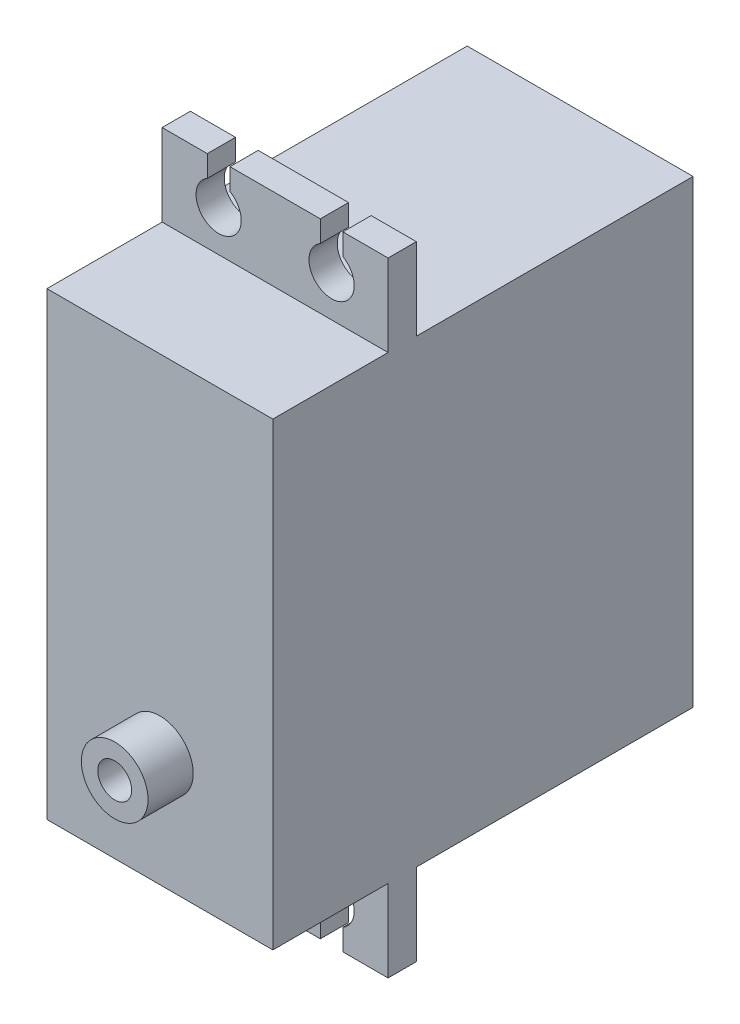
ISO-10303-21;
HEADER;
FILE_DESCRIPTION(('STEP AP214'),'2;1');
FILE_NAME('part.step','',(''),(''),'','','');
FILE_SCHEMA(('AUTOMOTIVE_DESIGN { 1 0 10303 214 1 1 1 1 }'));
ENDSEC;
DATA;
#1=APPLICATION_CONTEXT('core data for automotive mechanical design processes');
#2=APPLICATION_PROTOCOL_DEFINITION('international standard','automotive_design',2000,#1);
#3=PRODUCT_CONTEXT('',#1,'mechanical');
#4=PRODUCT('Part','Part','',(#3));
#5=PRODUCT_RELATED_PRODUCT_CATEGORY('part','',(#4));
#6=PRODUCT_DEFINITION_FORMATION('','',#4);
#7=PRODUCT_DEFINITION_CONTEXT('part definition',#1,'design');
#8=PRODUCT_DEFINITION('design','',#6,#7);
#9=PRODUCT_DEFINITION_SHAPE('','',#8);
#10=(LENGTH_UNIT() NAMED_UNIT(*) SI_UNIT(.MILLI.,.METRE.));
#11=(NAMED_UNIT(*) PLANE_ANGLE_UNIT() SI_UNIT($,.RADIAN.));
#12=(NAMED_UNIT(*) SI_UNIT($,.STERADIAN.) SOLID_ANGLE_UNIT());
#13=UNCERTAINTY_MEASURE_WITH_UNIT(LENGTH_MEASURE(1.E-05),#10,'distance_accuracy_value','');
#14=(GEOMETRIC_REPRESENTATION_CONTEXT(3) GLOBAL_UNCERTAINTY_ASSIGNED_CONTEXT((#13)) GLOBAL_UNIT_ASSIGNED_CONTEXT((#10,
#11,#12)) REPRESENTATION_CONTEXT('',''));
#15=CARTESIAN_POINT('',(0.,0.,0.));
#16=DIRECTION('',(0.,0.,1.));
#17=DIRECTION('',(1.,0.,0.));
#18=AXIS2_PLACEMENT_3D('',#15,#16,#17);
#19=CARTESIAN_POINT('',(10.,-20.35,5.89999999999999));
#20=DIRECTION('',(0.,1.,0.));
#21=DIRECTION('',(0.,0.,1.));
#22=AXIS2_PLACEMENT_3D('',#19,#20,#21);
#23=PLANE('',#22);
#24=DIRECTION('',(0.,0.,-1.));
#25=VECTOR('',#24,1.);
#26=CARTESIAN_POINT('',(-10.,-20.35,5.89999999999999));
#27=LINE('',#26,#25);
#28=CARTESIAN_POINT('',(-10.,-20.35,5.89999999999999));
#29=VERTEX_POINT('',#28);
#30=CARTESIAN_POINT('',(-10.,-20.35,-18.6));
#31=VERTEX_POINT('',#30);
#32=EDGE_CURVE('E369',#29,#31,#27,.T.);
#33=ORIENTED_EDGE('',*,*,#32,.T.);
#34=DIRECTION('',(-1.,0.,0.));
#35=VECTOR('',#34,1.);
#36=CARTESIAN_POINT('',(10.,-20.35,-18.6));
#37=LINE('',#36,#35);
#38=CARTESIAN_POINT('',(10.,-20.35,-18.6));
#39=VERTEX_POINT('',#38);
#40=EDGE_CURVE('E530',#39,#31,#37,.T.);
#41=ORIENTED_EDGE('',*,*,#40,.F.);
#42=DIRECTION('',(0.,0.,-1.));
#43=VECTOR('',#42,1.);
#44=CARTESIAN_POINT('',(10.,-20.35,5.89999999999999));
#45=LINE('',#44,#43);
#46=CARTESIAN_POINT('',(10.,-20.35,5.89999999999999));
#47=VERTEX_POINT('',#46);
#48=EDGE_CURVE('E401',#47,#39,#45,.T.);
#49=ORIENTED_EDGE('',*,*,#48,.F.);
#50=DIRECTION('',(-1.,0.,0.));
#51=VECTOR('',#50,1.);
#52=CARTESIAN_POINT('',(10.,-20.35,5.89999999999999));
#53=LINE('',#52,#51);
#54=EDGE_CURVE('E439',#47,#29,#53,.T.);
#55=ORIENTED_EDGE('',*,*,#54,.T.);
#56=EDGE_LOOP('',(#33,#41,#49,#55));
#57=FACE_BOUND('',#56,.T.);
#58=DIRECTION('',(0.,0.,-1.));
#59=VECTOR('',#58,1.);
#60=CARTESIAN_POINT('',(-3.,-20.35,-16.6));
#61=LINE('',#60,#59);
#62=CARTESIAN_POINT('',(-3.,-20.35,-13.1));
#63=VERTEX_POINT('',#62);
#64=CARTESIAN_POINT('',(-3.,-20.35,-16.6));
#65=VERTEX_POINT('',#64);
#66=EDGE_CURVE('E276',#63,#65,#61,.T.);
#67=ORIENTED_EDGE('',*,*,#66,.F.);
#68=DIRECTION('',(-1.,0.,0.));
#69=VECTOR('',#68,1.);
#70=CARTESIAN_POINT('',(3.,-20.35,-13.1));
#71=LINE('',#70,#69);
#72=CARTESIAN_POINT('',(3.,-20.35,-13.1));
#73=VERTEX_POINT('',#72);
#74=EDGE_CURVE('E273',#73,#63,#71,.T.);
#75=ORIENTED_EDGE('',*,*,#74,.F.);
#76=DIRECTION('',(0.,0.,1.));
#77=VECTOR('',#76,1.);
#78=CARTESIAN_POINT('',(3.,-20.35,-16.6));
#79=LINE('',#78,#77);
#80=CARTESIAN_POINT('',(3.,-20.35,-16.6));
#81=VERTEX_POINT('',#80);
#82=EDGE_CURVE('E65',#81,#73,#79,.T.);
#83=ORIENTED_EDGE('',*,*,#82,.F.);
#84=DIRECTION('',(1.,0.,0.));
#85=VECTOR('',#84,1.);
#86=CARTESIAN_POINT('',(3.,-20.35,-16.6));
#87=LINE('',#86,#85);
#88=EDGE_CURVE('E60',#65,#81,#87,.T.);
#89=ORIENTED_EDGE('',*,*,#88,.F.);
#90=EDGE_LOOP('',(#67,#75,#83,#89));
#91=FACE_BOUND('',#90,.T.);
#92=ADVANCED_FACE('F45',(#57,#91),#23,.F.);
#93=CARTESIAN_POINT('',(10.,20.35,5.89999999999999));
#94=DIRECTION('',(0.,0.,1.));
#95=DIRECTION('',(0.,-1.,0.));
#96=AXIS2_PLACEMENT_3D('',#93,#94,#95);
#97=PLANE('',#96);
#98=DIRECTION('',(0.,-1.,0.));
#99=VECTOR('',#98,1.);
#100=CARTESIAN_POINT('',(6.,20.35,5.89999999999999));
#101=LINE('',#100,#99);
#102=CARTESIAN_POINT('',(6.,27.6,5.89999999999999));
#103=VERTEX_POINT('',#102);
#104=CARTESIAN_POINT('',(6.,25.7070508075689,5.89999999999999));
#105=VERTEX_POINT('',#104);
#106=EDGE_CURVE('E349',#103,#105,#101,.T.);
#107=ORIENTED_EDGE('',*,*,#106,.F.);
#108=DIRECTION('',(-1.,0.,0.));
#109=VECTOR('',#108,1.);
#110=CARTESIAN_POINT('',(10.,27.6,5.89999999999999));
#111=LINE('',#110,#109);
#112=CARTESIAN_POINT('',(10.,27.6,5.89999999999999));
#113=VERTEX_POINT('',#112);
#114=EDGE_CURVE('E517',#113,#103,#111,.T.);
#115=ORIENTED_EDGE('',*,*,#114,.F.);
#116=DIRECTION('',(0.,1.,0.));
#117=VECTOR('',#116,1.);
#118=CARTESIAN_POINT('',(10.,20.35,5.89999999999999));
#119=LINE('',#118,#117);
#120=CARTESIAN_POINT('',(10.,20.35,5.89999999999999));
#121=VERTEX_POINT('',#120);
#122=EDGE_CURVE('E412',#121,#113,#119,.T.);
#123=ORIENTED_EDGE('',*,*,#122,.F.);
#124=DIRECTION('',(-1.,0.,0.));
#125=VECTOR('',#124,1.);
#126=CARTESIAN_POINT('',(10.,20.35,5.89999999999999));
#127=LINE('',#126,#125);
#128=CARTESIAN_POINT('',(-10.,20.35,5.89999999999999));
#129=VERTEX_POINT('',#128);
#130=EDGE_CURVE('E521',#121,#129,#127,.T.);
#131=ORIENTED_EDGE('',*,*,#130,.T.);
#132=DIRECTION('',(0.,1.,0.));
#133=VECTOR('',#132,1.);
#134=CARTESIAN_POINT('',(-10.,20.35,5.89999999999999));
#135=LINE('',#134,#133);
#136=CARTESIAN_POINT('',(-10.,27.6,5.89999999999999));
#137=VERTEX_POINT('',#136);
#138=EDGE_CURVE('E449',#129,#137,#135,.T.);
#139=ORIENTED_EDGE('',*,*,#138,.T.);
#140=CARTESIAN_POINT('',(-6.,27.6,5.89999999999999));
#141=VERTEX_POINT('',#140);
#142=EDGE_CURVE('E515',#141,#137,#111,.T.);
#143=ORIENTED_EDGE('',*,*,#142,.F.);
#144=DIRECTION('',(0.,1.,0.));
#145=VECTOR('',#144,1.);
#146=CARTESIAN_POINT('',(-6.,20.35,5.89999999999999));
#147=LINE('',#146,#145);
#148=CARTESIAN_POINT('',(-6.,25.7070508075689,5.89999999999999));
#149=VERTEX_POINT('',#148);
#150=EDGE_CURVE('E306',#149,#141,#147,.T.);
#151=ORIENTED_EDGE('',*,*,#150,.F.);
#152=CARTESIAN_POINT('',(-5.,23.975,5.89999999999999));
#153=DIRECTION('',(0.,0.,1.));
#154=DIRECTION('',(0.,-1.,0.));
#155=AXIS2_PLACEMENT_3D('',#152,#153,#154);
#156=CIRCLE('',#155,2.);
#157=CARTESIAN_POINT('',(-4.,25.7070508075689,5.89999999999999));
#158=VERTEX_POINT('',#157);
#159=EDGE_CURVE('E337',#158,#149,#156,.F.);
#160=ORIENTED_EDGE('',*,*,#159,.F.);
#161=DIRECTION('',(0.,-1.,0.));
#162=VECTOR('',#161,1.);
#163=CARTESIAN_POINT('',(-4.,20.35,5.89999999999999));
#164=LINE('',#163,#162);
#165=CARTESIAN_POINT('',(-4.,27.6,5.89999999999999));
#166=VERTEX_POINT('',#165);
#167=EDGE_CURVE('E340',#166,#158,#164,.T.);
#168=ORIENTED_EDGE('',*,*,#167,.F.);
#169=CARTESIAN_POINT('',(4.,27.6,5.89999999999999));
#170=VERTEX_POINT('',#169);
#171=EDGE_CURVE('E522',#170,#166,#111,.T.);
#172=ORIENTED_EDGE('',*,*,#171,.F.);
#173=DIRECTION('',(0.,1.,0.));
#174=VECTOR('',#173,1.);
#175=CARTESIAN_POINT('',(4.,20.35,5.89999999999999));
#176=LINE('',#175,#174);
#177=CARTESIAN_POINT('',(4.,25.7070508075689,5.89999999999999));
#178=VERTEX_POINT('',#177);
#179=EDGE_CURVE('E343',#178,#170,#176,.T.);
#180=ORIENTED_EDGE('',*,*,#179,.F.);
#181=CARTESIAN_POINT('',(5.,23.975,5.89999999999999));
#182=DIRECTION('',(0.,0.,1.));
#183=DIRECTION('',(0.,-1.,0.));
#184=AXIS2_PLACEMENT_3D('',#181,#182,#183);
#185=CIRCLE('',#184,2.);
#186=EDGE_CURVE('E346',#105,#178,#185,.F.);
#187=ORIENTED_EDGE('',*,*,#186,.F.);
#188=EDGE_LOOP('',(#107,#115,#123,#131,#139,#143,#151,#160,#168,#172,#180,#187));
#189=FACE_BOUND('',#188,.T.);
#190=ADVANCED_FACE('F635',(#189),#97,.F.);
#191=CARTESIAN_POINT('',(10.,27.6,5.89999999999999));
#192=DIRECTION('',(0.,-1.,0.));
#193=DIRECTION('',(0.,0.,-1.));
#194=AXIS2_PLACEMENT_3D('',#191,#192,#193);
#195=PLANE('',#194);
#196=DIRECTION('',(0.,0.,1.));
#197=VECTOR('',#196,1.);
#198=CARTESIAN_POINT('',(6.,27.6,-18.6));
#199=LINE('',#198,#197);
#200=CARTESIAN_POINT('',(6.,27.6,8.39999999999999));
#201=VERTEX_POINT('',#200);
#202=EDGE_CURVE('E302',#103,#201,#199,.T.);
#203=ORIENTED_EDGE('',*,*,#202,.T.);
#204=DIRECTION('',(-1.,0.,0.));
#205=VECTOR('',#204,1.);
#206=CARTESIAN_POINT('',(10.,27.6,8.39999999999999));
#207=LINE('',#206,#205);
#208=CARTESIAN_POINT('',(10.,27.6,8.39999999999999));
#209=VERTEX_POINT('',#208);
#210=EDGE_CURVE('E511',#209,#201,#207,.T.);
#211=ORIENTED_EDGE('',*,*,#210,.F.);
#212=DIRECTION('',(0.,0.,1.));
#213=VECTOR('',#212,1.);
#214=CARTESIAN_POINT('',(10.,27.6,5.89999999999999));
#215=LINE('',#214,#213);
#216=EDGE_CURVE('E415',#113,#209,#215,.T.);
#217=ORIENTED_EDGE('',*,*,#216,.F.);
#218=ORIENTED_EDGE('',*,*,#114,.T.);
#219=EDGE_LOOP('',(#203,#211,#217,#218));
#220=FACE_BOUND('',#219,.T.);
#221=ADVANCED_FACE('F649',(#220),#195,.F.);
#222=DIRECTION('',(0.,0.,1.));
#223=VECTOR('',#222,1.);
#224=CARTESIAN_POINT('',(4.,27.6,-18.6));
#225=LINE('',#224,#223);
#226=CARTESIAN_POINT('',(4.,27.6,8.39999999999999));
#227=VERTEX_POINT('',#226);
#228=EDGE_CURVE('E310',#170,#227,#225,.T.);
#229=ORIENTED_EDGE('',*,*,#228,.F.);
#230=ORIENTED_EDGE('',*,*,#171,.T.);
#231=DIRECTION('',(0.,0.,1.));
#232=VECTOR('',#231,1.);
#233=CARTESIAN_POINT('',(-4.,27.6,-18.6));
#234=LINE('',#233,#232);
#235=CARTESIAN_POINT('',(-4.,27.6,8.39999999999999));
#236=VERTEX_POINT('',#235);
#237=EDGE_CURVE('E294',#166,#236,#234,.T.);
#238=ORIENTED_EDGE('',*,*,#237,.T.);
#239=EDGE_CURVE('E516',#227,#236,#207,.T.);
#240=ORIENTED_EDGE('',*,*,#239,.F.);
#241=EDGE_LOOP('',(#229,#230,#238,#240));
#242=FACE_BOUND('',#241,.T.);
#243=ADVANCED_FACE('F665',(#242),#195,.F.);
#244=DIRECTION('',(0.,0.,1.));
#245=VECTOR('',#244,1.);
#246=CARTESIAN_POINT('',(-6.,27.6,-18.6));
#247=LINE('',#246,#245);
#248=CARTESIAN_POINT('',(-6.,27.6,8.39999999999999));
#249=VERTEX_POINT('',#248);
#250=EDGE_CURVE('E323',#141,#249,#247,.T.);
#251=ORIENTED_EDGE('',*,*,#250,.F.);
#252=ORIENTED_EDGE('',*,*,#142,.T.);
#253=DIRECTION('',(0.,0.,1.));
#254=VECTOR('',#253,1.);
#255=CARTESIAN_POINT('',(-10.,27.6,5.89999999999999));
#256=LINE('',#255,#254);
#257=CARTESIAN_POINT('',(-10.,27.6,8.39999999999999));
#258=VERTEX_POINT('',#257);
#259=EDGE_CURVE('E453',#137,#258,#256,.T.);
#260=ORIENTED_EDGE('',*,*,#259,.T.);
#261=EDGE_CURVE('E510',#249,#258,#207,.T.);
#262=ORIENTED_EDGE('',*,*,#261,.F.);
#263=EDGE_LOOP('',(#251,#252,#260,#262));
#264=FACE_BOUND('',#263,.T.);
#265=ADVANCED_FACE('F629',(#264),#195,.F.);
#266=CARTESIAN_POINT('',(10.,27.6,8.39999999999999));
#267=DIRECTION('',(0.,0.,-1.));
#268=DIRECTION('',(0.,1.,0.));
#269=AXIS2_PLACEMENT_3D('',#266,#267,#268);
#270=PLANE('',#269);
#271=DIRECTION('',(0.,-1.,0.));
#272=VECTOR('',#271,1.);
#273=CARTESIAN_POINT('',(6.,25.7070508075689,8.39999999999999));
#274=LINE('',#273,#272);
#275=CARTESIAN_POINT('',(6.,25.7070508075689,8.39999999999999));
#276=VERTEX_POINT('',#275);
#277=EDGE_CURVE('E289',#201,#276,#274,.T.);
#278=ORIENTED_EDGE('',*,*,#277,.T.);
#279=CARTESIAN_POINT('',(5.,23.975,8.39999999999999));
#280=DIRECTION('',(0.,0.,-1.));
#281=DIRECTION('',(-1.,0.,0.));
#282=AXIS2_PLACEMENT_3D('',#279,#280,#281);
#283=CIRCLE('',#282,2.);
#284=CARTESIAN_POINT('',(4.,25.7070508075689,8.39999999999999));
#285=VERTEX_POINT('',#284);
#286=EDGE_CURVE('E298',#276,#285,#283,.T.);
#287=ORIENTED_EDGE('',*,*,#286,.T.);
#288=DIRECTION('',(0.,1.,0.));
#289=VECTOR('',#288,1.);
#290=CARTESIAN_POINT('',(4.,27.6,8.39999999999999));
#291=LINE('',#290,#289);
#292=EDGE_CURVE('E293',#285,#227,#291,.T.);
#293=ORIENTED_EDGE('',*,*,#292,.T.);
#294=ORIENTED_EDGE('',*,*,#239,.T.);
#295=DIRECTION('',(0.,-1.,0.));
#296=VECTOR('',#295,1.);
#297=CARTESIAN_POINT('',(-4.,27.6,8.39999999999999));
#298=LINE('',#297,#296);
#299=CARTESIAN_POINT('',(-4.,25.7070508075689,8.39999999999999));
#300=VERTEX_POINT('',#299);
#301=EDGE_CURVE('E319',#236,#300,#298,.T.);
#302=ORIENTED_EDGE('',*,*,#301,.T.);
#303=CARTESIAN_POINT('',(-5.,23.975,8.39999999999999));
#304=DIRECTION('',(0.,0.,-1.));
#305=DIRECTION('',(1.,0.,0.));
#306=AXIS2_PLACEMENT_3D('',#303,#304,#305);
#307=CIRCLE('',#306,2.);
#308=CARTESIAN_POINT('',(-6.,25.7070508075689,8.39999999999999));
#309=VERTEX_POINT('',#308);
#310=EDGE_CURVE('E283',#300,#309,#307,.T.);
#311=ORIENTED_EDGE('',*,*,#310,.T.);
#312=DIRECTION('',(0.,1.,0.));
#313=VECTOR('',#312,1.);
#314=CARTESIAN_POINT('',(-6.,25.7070508075689,8.39999999999999));
#315=LINE('',#314,#313);
#316=EDGE_CURVE('E278',#309,#249,#315,.T.);
#317=ORIENTED_EDGE('',*,*,#316,.T.);
#318=ORIENTED_EDGE('',*,*,#261,.T.);
#319=DIRECTION('',(0.,-1.,0.));
#320=VECTOR('',#319,1.);
#321=CARTESIAN_POINT('',(-10.,27.6,8.39999999999999));
#322=LINE('',#321,#320);
#323=CARTESIAN_POINT('',(-10.,20.35,8.39999999999999));
#324=VERTEX_POINT('',#323);
#325=EDGE_CURVE('E457',#258,#324,#322,.T.);
#326=ORIENTED_EDGE('',*,*,#325,.T.);
#327=DIRECTION('',(-1.,0.,0.));
#328=VECTOR('',#327,1.);
#329=CARTESIAN_POINT('',(10.,20.35,8.39999999999999));
#330=LINE('',#329,#328);
#331=CARTESIAN_POINT('',(10.,20.35,8.39999999999999));
#332=VERTEX_POINT('',#331);
#333=EDGE_CURVE('E506',#332,#324,#330,.T.);
#334=ORIENTED_EDGE('',*,*,#333,.F.);
#335=DIRECTION('',(0.,-1.,0.));
#336=VECTOR('',#335,1.);
#337=CARTESIAN_POINT('',(10.,27.6,8.39999999999999));
#338=LINE('',#337,#336);
#339=EDGE_CURVE('E418',#209,#332,#338,.T.);
#340=ORIENTED_EDGE('',*,*,#339,.F.);
#341=ORIENTED_EDGE('',*,*,#210,.T.);
#342=EDGE_LOOP('',(#278,#287,#293,#294,#302,#311,#317,#318,#326,#334,#340,#341));
#343=FACE_BOUND('',#342,.T.);
#344=ADVANCED_FACE('F623',(#343),#270,.F.);
#345=CARTESIAN_POINT('',(10.,-27.6,5.89999999999999));
#346=DIRECTION('',(0.,1.,0.));
#347=DIRECTION('',(0.,0.,1.));
#348=AXIS2_PLACEMENT_3D('',#345,#346,#347);
#349=PLANE('',#348);
#350=DIRECTION('',(-1.,0.,0.));
#351=VECTOR('',#350,1.);
#352=CARTESIAN_POINT('',(10.,-27.6,8.39999999999999));
#353=LINE('',#352,#351);
#354=CARTESIAN_POINT('',(10.,-27.6,8.39999999999999));
#355=VERTEX_POINT('',#354);
#356=CARTESIAN_POINT('',(6.,-27.6,8.39999999999999));
#357=VERTEX_POINT('',#356);
#358=EDGE_CURVE('E489',#355,#357,#353,.T.);
#359=ORIENTED_EDGE('',*,*,#358,.T.);
#360=DIRECTION('',(0.,0.,1.));
#361=VECTOR('',#360,1.);
#362=CARTESIAN_POINT('',(6.,-27.6,-18.6));
#363=LINE('',#362,#361);
#364=CARTESIAN_POINT('',(6.,-27.6,5.89999999999999));
#365=VERTEX_POINT('',#364);
#366=EDGE_CURVE('E366',#365,#357,#363,.T.);
#367=ORIENTED_EDGE('',*,*,#366,.F.);
#368=DIRECTION('',(-1.,0.,0.));
#369=VECTOR('',#368,1.);
#370=CARTESIAN_POINT('',(10.,-27.6,5.89999999999999));
#371=LINE('',#370,#369);
#372=CARTESIAN_POINT('',(10.,-27.6,5.89999999999999));
#373=VERTEX_POINT('',#372);
#374=EDGE_CURVE('E483',#373,#365,#371,.T.);
#375=ORIENTED_EDGE('',*,*,#374,.F.);
#376=DIRECTION('',(0.,0.,-1.));
#377=VECTOR('',#376,1.);
#378=CARTESIAN_POINT('',(10.,-27.6,5.89999999999999));
#379=LINE('',#378,#377);
#380=EDGE_CURVE('E433',#355,#373,#379,.T.);
#381=ORIENTED_EDGE('',*,*,#380,.F.);
#382=EDGE_LOOP('',(#359,#367,#375,#381));
#383=FACE_BOUND('',#382,.T.);
#384=ADVANCED_FACE('F565',(#383),#349,.F.);
#385=CARTESIAN_POINT('',(-6.,-27.6,5.89999999999999));
#386=VERTEX_POINT('',#385);
#387=CARTESIAN_POINT('',(-10.,-27.6,5.89999999999999));
#388=VERTEX_POINT('',#387);
#389=EDGE_CURVE('E482',#386,#388,#371,.T.);
#390=ORIENTED_EDGE('',*,*,#389,.F.);
#391=DIRECTION('',(0.,0.,1.));
#392=VECTOR('',#391,1.);
#393=CARTESIAN_POINT('',(-6.,-27.6,-18.6));
#394=LINE('',#393,#392);
#395=CARTESIAN_POINT('',(-6.,-27.6,8.39999999999999));
#396=VERTEX_POINT('',#395);
#397=EDGE_CURVE('E352',#386,#396,#394,.T.);
#398=ORIENTED_EDGE('',*,*,#397,.T.);
#399=CARTESIAN_POINT('',(-10.,-27.6,8.39999999999999));
#400=VERTEX_POINT('',#399);
#401=EDGE_CURVE('E487',#396,#400,#353,.T.);
#402=ORIENTED_EDGE('',*,*,#401,.T.);
#403=DIRECTION('',(0.,0.,-1.));
#404=VECTOR('',#403,1.);
#405=CARTESIAN_POINT('',(-10.,-27.6,5.89999999999999));
#406=LINE('',#405,#404);
#407=EDGE_CURVE('E473',#400,#388,#406,.T.);
#408=ORIENTED_EDGE('',*,*,#407,.T.);
#409=EDGE_LOOP('',(#390,#398,#402,#408));
#410=FACE_BOUND('',#409,.T.);
#411=ADVANCED_FACE('F592',(#410),#349,.F.);
#412=CARTESIAN_POINT('',(10.,20.35,-18.6));
#413=DIRECTION('',(0.,0.,1.));
#414=DIRECTION('',(1.,0.,0.));
#415=AXIS2_PLACEMENT_3D('',#412,#413,#414);
#416=PLANE('',#415);
#417=DIRECTION('',(0.,1.,0.));
#418=VECTOR('',#417,1.);
#419=CARTESIAN_POINT('',(-10.,20.35,-18.6));
#420=LINE('',#419,#418);
#421=CARTESIAN_POINT('',(-10.,20.35,-18.6));
#422=VERTEX_POINT('',#421);
#423=EDGE_CURVE('E443',#31,#422,#420,.T.);
#424=ORIENTED_EDGE('',*,*,#423,.T.);
#425=DIRECTION('',(-1.,0.,0.));
#426=VECTOR('',#425,1.);
#427=CARTESIAN_POINT('',(10.,20.35,-18.6));
#428=LINE('',#427,#426);
#429=CARTESIAN_POINT('',(10.,20.35,-18.6));
#430=VERTEX_POINT('',#429);
#431=EDGE_CURVE('E526',#430,#422,#428,.T.);
#432=ORIENTED_EDGE('',*,*,#431,.F.);
#433=DIRECTION('',(0.,1.,0.));
#434=VECTOR('',#433,1.);
#435=CARTESIAN_POINT('',(10.,20.35,-18.6));
#436=LINE('',#435,#434);
#437=EDGE_CURVE('E405',#39,#430,#436,.T.);
#438=ORIENTED_EDGE('',*,*,#437,.F.);
#439=ORIENTED_EDGE('',*,*,#40,.T.);
#440=EDGE_LOOP('',(#424,#432,#438,#439));
#441=FACE_BOUND('',#440,.T.);
#442=ADVANCED_FACE('F644',(#441),#416,.F.);
#443=CARTESIAN_POINT('',(10.,20.35,5.89999999999999));
#444=DIRECTION('',(0.,-1.,0.));
#445=DIRECTION('',(0.,0.,-1.));
#446=AXIS2_PLACEMENT_3D('',#443,#444,#445);
#447=PLANE('',#446);
#448=DIRECTION('',(0.,0.,1.));
#449=VECTOR('',#448,1.);
#450=CARTESIAN_POINT('',(-10.,20.35,5.89999999999999));
#451=LINE('',#450,#449);
#452=EDGE_CURVE('E446',#422,#129,#451,.T.);
#453=ORIENTED_EDGE('',*,*,#452,.T.);
#454=ORIENTED_EDGE('',*,*,#130,.F.);
#455=DIRECTION('',(0.,0.,1.));
#456=VECTOR('',#455,1.);
#457=CARTESIAN_POINT('',(10.,20.35,5.89999999999999));
#458=LINE('',#457,#456);
#459=EDGE_CURVE('E409',#430,#121,#458,.T.);
#460=ORIENTED_EDGE('',*,*,#459,.F.);
#461=ORIENTED_EDGE('',*,*,#431,.T.);
#462=EDGE_LOOP('',(#453,#454,#460,#461));
#463=FACE_BOUND('',#462,.T.);
#464=ADVANCED_FACE('F641',(#463),#447,.F.);
#465=CARTESIAN_POINT('',(10.,20.35,18.6));
#466=DIRECTION('',(0.,-1.,0.));
#467=DIRECTION('',(0.,0.,-1.));
#468=AXIS2_PLACEMENT_3D('',#465,#466,#467);
#469=PLANE('',#468);
#470=DIRECTION('',(0.,0.,1.));
#471=VECTOR('',#470,1.);
#472=CARTESIAN_POINT('',(-10.,20.35,18.6));
#473=LINE('',#472,#471);
#474=CARTESIAN_POINT('',(-10.,20.35,18.6));
#475=VERTEX_POINT('',#474);
#476=EDGE_CURVE('E460',#324,#475,#473,.T.);
#477=ORIENTED_EDGE('',*,*,#476,.T.);
#478=DIRECTION('',(-1.,0.,0.));
#479=VECTOR('',#478,1.);
#480=CARTESIAN_POINT('',(10.,20.35,18.6));
#481=LINE('',#480,#479);
#482=CARTESIAN_POINT('',(10.,20.35,18.6));
#483=VERTEX_POINT('',#482);
#484=EDGE_CURVE('E502',#483,#475,#481,.T.);
#485=ORIENTED_EDGE('',*,*,#484,.F.);
#486=DIRECTION('',(0.,0.,1.));
#487=VECTOR('',#486,1.);
#488=CARTESIAN_POINT('',(10.,20.35,18.6));
#489=LINE('',#488,#487);
#490=EDGE_CURVE('E421',#332,#483,#489,.T.);
#491=ORIENTED_EDGE('',*,*,#490,.F.);
#492=ORIENTED_EDGE('',*,*,#333,.T.);
#493=EDGE_LOOP('',(#477,#485,#491,#492));
#494=FACE_BOUND('',#493,.T.);
#495=ADVANCED_FACE('F619',(#494),#469,.F.);
#496=CARTESIAN_POINT('',(10.,20.35,18.6));
#497=DIRECTION('',(0.,0.,-1.));
#498=DIRECTION('',(-1.,0.,0.));
#499=AXIS2_PLACEMENT_3D('',#496,#497,#498);
#500=PLANE('',#499);
#501=CARTESIAN_POINT('',(0.,-10.35,18.6));
#502=DIRECTION('',(0.,0.,-1.));
#503=DIRECTION('',(-1.,0.,0.));
#504=AXIS2_PLACEMENT_3D('',#501,#502,#503);
#505=CIRCLE('',#504,2.95);
#506=CARTESIAN_POINT('',(-2.95,-10.35,18.6));
#507=VERTEX_POINT('',#506);
#508=EDGE_CURVE('E11',#507,#507,#505,.F.);
#509=ORIENTED_EDGE('',*,*,#508,.F.);
#510=EDGE_LOOP('',(#509));
#511=FACE_BOUND('',#510,.T.);
#512=DIRECTION('',(0.,-1.,0.));
#513=VECTOR('',#512,1.);
#514=CARTESIAN_POINT('',(-10.,20.35,18.6));
#515=LINE('',#514,#513);
#516=CARTESIAN_POINT('',(-10.,-20.35,18.6));
#517=VERTEX_POINT('',#516);
#518=EDGE_CURVE('E463',#475,#517,#515,.T.);
#519=ORIENTED_EDGE('',*,*,#518,.T.);
#520=DIRECTION('',(-1.,0.,0.));
#521=VECTOR('',#520,1.);
#522=CARTESIAN_POINT('',(10.,-20.35,18.6));
#523=LINE('',#522,#521);
#524=CARTESIAN_POINT('',(10.,-20.35,18.6));
#525=VERTEX_POINT('',#524);
#526=EDGE_CURVE('E498',#525,#517,#523,.T.);
#527=ORIENTED_EDGE('',*,*,#526,.F.);
#528=DIRECTION('',(0.,-1.,0.));
#529=VECTOR('',#528,1.);
#530=CARTESIAN_POINT('',(10.,20.35,18.6));
#531=LINE('',#530,#529);
#532=EDGE_CURVE('E424',#483,#525,#531,.T.);
#533=ORIENTED_EDGE('',*,*,#532,.F.);
#534=ORIENTED_EDGE('',*,*,#484,.T.);
#535=EDGE_LOOP('',(#519,#527,#533,#534));
#536=FACE_BOUND('',#535,.T.);
#537=ADVANCED_FACE('F615',(#511,#536),#500,.F.);
#538=CARTESIAN_POINT('',(10.,-20.35,18.6));
#539=DIRECTION('',(0.,1.,0.));
#540=DIRECTION('',(0.,0.,1.));
#541=AXIS2_PLACEMENT_3D('',#538,#539,#540);
#542=PLANE('',#541);
#543=DIRECTION('',(0.,0.,-1.));
#544=VECTOR('',#543,1.);
#545=CARTESIAN_POINT('',(-10.,-20.35,18.6));
#546=LINE('',#545,#544);
#547=CARTESIAN_POINT('',(-10.,-20.35,8.39999999999999));
#548=VERTEX_POINT('',#547);
#549=EDGE_CURVE('E466',#517,#548,#546,.T.);
#550=ORIENTED_EDGE('',*,*,#549,.T.);
#551=DIRECTION('',(-1.,0.,0.));
#552=VECTOR('',#551,1.);
#553=CARTESIAN_POINT('',(10.,-20.35,8.39999999999999));
#554=LINE('',#553,#552);
#555=CARTESIAN_POINT('',(10.,-20.35,8.39999999999999));
#556=VERTEX_POINT('',#555);
#557=EDGE_CURVE('E493',#556,#548,#554,.T.);
#558=ORIENTED_EDGE('',*,*,#557,.F.);
#559=DIRECTION('',(0.,0.,-1.));
#560=VECTOR('',#559,1.);
#561=CARTESIAN_POINT('',(10.,-20.35,18.6));
#562=LINE('',#561,#560);
#563=EDGE_CURVE('E427',#525,#556,#562,.T.);
#564=ORIENTED_EDGE('',*,*,#563,.F.);
#565=ORIENTED_EDGE('',*,*,#526,.T.);
#566=EDGE_LOOP('',(#550,#558,#564,#565));
#567=FACE_BOUND('',#566,.T.);
#568=ADVANCED_FACE('F609',(#567),#542,.F.);
#569=CARTESIAN_POINT('',(10.,-27.6,8.39999999999999));
#570=DIRECTION('',(0.,0.,-1.));
#571=DIRECTION('',(0.,1.,0.));
#572=AXIS2_PLACEMENT_3D('',#569,#570,#571);
#573=PLANE('',#572);
#574=CARTESIAN_POINT('',(5.,-23.975,8.39999999999999));
#575=DIRECTION('',(0.,0.,1.));
#576=DIRECTION('',(-1.,0.,0.));
#577=AXIS2_PLACEMENT_3D('',#574,#575,#576);
#578=CIRCLE('',#577,2.);
#579=CARTESIAN_POINT('',(6.,-25.7070508075689,8.39999999999999));
#580=VERTEX_POINT('',#579);
#581=CARTESIAN_POINT('',(4.,-25.7070508075689,8.39999999999999));
#582=VERTEX_POINT('',#581);
#583=EDGE_CURVE('E357',#580,#582,#578,.T.);
#584=ORIENTED_EDGE('',*,*,#583,.F.);
#585=DIRECTION('',(0.,1.,0.));
#586=VECTOR('',#585,1.);
#587=CARTESIAN_POINT('',(6.,-25.7070508075689,8.39999999999999));
#588=LINE('',#587,#586);
#589=EDGE_CURVE('E353',#357,#580,#588,.T.);
#590=ORIENTED_EDGE('',*,*,#589,.F.);
#591=ORIENTED_EDGE('',*,*,#358,.F.);
#592=DIRECTION('',(0.,-1.,0.));
#593=VECTOR('',#592,1.);
#594=CARTESIAN_POINT('',(10.,-27.6,8.39999999999999));
#595=LINE('',#594,#593);
#596=EDGE_CURVE('E430',#556,#355,#595,.T.);
#597=ORIENTED_EDGE('',*,*,#596,.F.);
#598=ORIENTED_EDGE('',*,*,#557,.T.);
#599=DIRECTION('',(0.,-1.,0.));
#600=VECTOR('',#599,1.);
#601=CARTESIAN_POINT('',(-10.,-27.6,8.39999999999999));
#602=LINE('',#601,#600);
#603=EDGE_CURVE('E469',#548,#400,#602,.T.);
#604=ORIENTED_EDGE('',*,*,#603,.T.);
#605=ORIENTED_EDGE('',*,*,#401,.F.);
#606=DIRECTION('',(0.,-1.,0.));
#607=VECTOR('',#606,1.);
#608=CARTESIAN_POINT('',(-6.,-25.7070508075689,8.39999999999999));
#609=LINE('',#608,#607);
#610=CARTESIAN_POINT('',(-6.,-25.7070508075689,8.39999999999999));
#611=VERTEX_POINT('',#610);
#612=EDGE_CURVE('E382',#611,#396,#609,.T.);
#613=ORIENTED_EDGE('',*,*,#612,.F.);
#614=CARTESIAN_POINT('',(-5.,-23.975,8.39999999999999));
#615=DIRECTION('',(0.,0.,1.));
#616=DIRECTION('',(1.,0.,0.));
#617=AXIS2_PLACEMENT_3D('',#614,#615,#616);
#618=CIRCLE('',#617,2.);
#619=CARTESIAN_POINT('',(-4.,-25.7070508075689,8.39999999999999));
#620=VERTEX_POINT('',#619);
#621=EDGE_CURVE('E394',#620,#611,#618,.T.);
#622=ORIENTED_EDGE('',*,*,#621,.F.);
#623=DIRECTION('',(0.,1.,0.));
#624=VECTOR('',#623,1.);
#625=CARTESIAN_POINT('',(-4.,-27.6,8.39999999999999));
#626=LINE('',#625,#624);
#627=CARTESIAN_POINT('',(-4.,-27.6,8.39999999999999));
#628=VERTEX_POINT('',#627);
#629=EDGE_CURVE('E358',#628,#620,#626,.T.);
#630=ORIENTED_EDGE('',*,*,#629,.F.);
#631=CARTESIAN_POINT('',(4.,-27.6,8.39999999999999));
#632=VERTEX_POINT('',#631);
#633=EDGE_CURVE('E494',#632,#628,#353,.T.);
#634=ORIENTED_EDGE('',*,*,#633,.F.);
#635=DIRECTION('',(0.,-1.,0.));
#636=VECTOR('',#635,1.);
#637=CARTESIAN_POINT('',(4.,-27.6,8.39999999999999));
#638=LINE('',#637,#636);
#639=EDGE_CURVE('E362',#582,#632,#638,.T.);
#640=ORIENTED_EDGE('',*,*,#639,.F.);
#641=EDGE_LOOP('',(#584,#590,#591,#597,#598,#604,#605,#613,#622,#630,#634,#640));
#642=FACE_BOUND('',#641,.T.);
#643=ADVANCED_FACE('F571',(#642),#573,.F.);
#644=CARTESIAN_POINT('',(4.,-27.6,5.89999999999999));
#645=VERTEX_POINT('',#644);
#646=CARTESIAN_POINT('',(-4.,-27.6,5.89999999999999));
#647=VERTEX_POINT('',#646);
#648=EDGE_CURVE('E488',#645,#647,#371,.T.);
#649=ORIENTED_EDGE('',*,*,#648,.F.);
#650=DIRECTION('',(0.,0.,1.));
#651=VECTOR('',#650,1.);
#652=CARTESIAN_POINT('',(4.,-27.6,-18.6));
#653=LINE('',#652,#651);
#654=EDGE_CURVE('E370',#645,#632,#653,.T.);
#655=ORIENTED_EDGE('',*,*,#654,.T.);
#656=ORIENTED_EDGE('',*,*,#633,.T.);
#657=DIRECTION('',(0.,0.,1.));
#658=VECTOR('',#657,1.);
#659=CARTESIAN_POINT('',(-4.,-27.6,-18.6));
#660=LINE('',#659,#658);
#661=EDGE_CURVE('E379',#647,#628,#660,.T.);
#662=ORIENTED_EDGE('',*,*,#661,.F.);
#663=EDGE_LOOP('',(#649,#655,#656,#662));
#664=FACE_BOUND('',#663,.T.);
#665=ADVANCED_FACE('F583',(#664),#349,.F.);
#666=CARTESIAN_POINT('',(10.,-20.35,5.89999999999999));
#667=DIRECTION('',(0.,0.,1.));
#668=DIRECTION('',(0.,-1.,0.));
#669=AXIS2_PLACEMENT_3D('',#666,#667,#668);
#670=PLANE('',#669);
#671=ORIENTED_EDGE('',*,*,#374,.T.);
#672=DIRECTION('',(0.,1.,0.));
#673=VECTOR('',#672,1.);
#674=CARTESIAN_POINT('',(6.,-20.35,5.89999999999999));
#675=LINE('',#674,#673);
#676=CARTESIAN_POINT('',(6.,-25.7070508075689,5.89999999999999));
#677=VERTEX_POINT('',#676);
#678=EDGE_CURVE('E53',#365,#677,#675,.T.);
#679=ORIENTED_EDGE('',*,*,#678,.T.);
#680=CARTESIAN_POINT('',(5.,-23.975,5.89999999999999));
#681=DIRECTION('',(0.,0.,1.));
#682=DIRECTION('',(0.,-1.,0.));
#683=AXIS2_PLACEMENT_3D('',#680,#681,#682);
#684=CIRCLE('',#683,2.);
#685=CARTESIAN_POINT('',(4.,-25.7070508075689,5.89999999999999));
#686=VERTEX_POINT('',#685);
#687=EDGE_CURVE('E546',#677,#686,#684,.T.);
#688=ORIENTED_EDGE('',*,*,#687,.T.);
#689=DIRECTION('',(0.,-1.,0.));
#690=VECTOR('',#689,1.);
#691=CARTESIAN_POINT('',(4.,-20.35,5.89999999999999));
#692=LINE('',#691,#690);
#693=EDGE_CURVE('E550',#686,#645,#692,.T.);
#694=ORIENTED_EDGE('',*,*,#693,.T.);
#695=ORIENTED_EDGE('',*,*,#648,.T.);
#696=DIRECTION('',(0.,1.,0.));
#697=VECTOR('',#696,1.);
#698=CARTESIAN_POINT('',(-4.,-20.35,5.89999999999999));
#699=LINE('',#698,#697);
#700=CARTESIAN_POINT('',(-4.,-25.7070508075689,5.89999999999999));
#701=VERTEX_POINT('',#700);
#702=EDGE_CURVE('E534',#647,#701,#699,.T.);
#703=ORIENTED_EDGE('',*,*,#702,.T.);
#704=CARTESIAN_POINT('',(-5.,-23.975,5.89999999999999));
#705=DIRECTION('',(0.,0.,1.));
#706=DIRECTION('',(0.,-1.,0.));
#707=AXIS2_PLACEMENT_3D('',#704,#705,#706);
#708=CIRCLE('',#707,2.);
#709=CARTESIAN_POINT('',(-6.,-25.7070508075689,5.89999999999999));
#710=VERTEX_POINT('',#709);
#711=EDGE_CURVE('E538',#701,#710,#708,.T.);
#712=ORIENTED_EDGE('',*,*,#711,.T.);
#713=DIRECTION('',(0.,-1.,0.));
#714=VECTOR('',#713,1.);
#715=CARTESIAN_POINT('',(-6.,-20.35,5.89999999999999));
#716=LINE('',#715,#714);
#717=EDGE_CURVE('E542',#710,#386,#716,.T.);
#718=ORIENTED_EDGE('',*,*,#717,.T.);
#719=ORIENTED_EDGE('',*,*,#389,.T.);
#720=DIRECTION('',(0.,1.,0.));
#721=VECTOR('',#720,1.);
#722=CARTESIAN_POINT('',(-10.,-20.35,5.89999999999999));
#723=LINE('',#722,#721);
#724=EDGE_CURVE('E406',#388,#29,#723,.T.);
#725=ORIENTED_EDGE('',*,*,#724,.T.);
#726=ORIENTED_EDGE('',*,*,#54,.F.);
#727=DIRECTION('',(0.,1.,0.));
#728=VECTOR('',#727,1.);
#729=CARTESIAN_POINT('',(10.,-20.35,5.89999999999999));
#730=LINE('',#729,#728);
#731=EDGE_CURVE('E436',#373,#47,#730,.T.);
#732=ORIENTED_EDGE('',*,*,#731,.F.);
#733=EDGE_LOOP('',(#671,#679,#688,#694,#695,#703,#712,#718,#719,#725,#726,#732));
#734=FACE_BOUND('',#733,.T.);
#735=ADVANCED_FACE('F556',(#734),#670,.F.);
#736=CARTESIAN_POINT('',(10.,0.,0.));
#737=DIRECTION('',(-1.,0.,0.));
#738=DIRECTION('',(0.,0.,1.));
#739=AXIS2_PLACEMENT_3D('',#736,#737,#738);
#740=PLANE('',#739);
#741=ORIENTED_EDGE('',*,*,#48,.T.);
#742=ORIENTED_EDGE('',*,*,#437,.T.);
#743=ORIENTED_EDGE('',*,*,#459,.T.);
#744=ORIENTED_EDGE('',*,*,#122,.T.);
#745=ORIENTED_EDGE('',*,*,#216,.T.);
#746=ORIENTED_EDGE('',*,*,#339,.T.);
#747=ORIENTED_EDGE('',*,*,#490,.T.);
#748=ORIENTED_EDGE('',*,*,#532,.T.);
#749=ORIENTED_EDGE('',*,*,#563,.T.);
#750=ORIENTED_EDGE('',*,*,#596,.T.);
#751=ORIENTED_EDGE('',*,*,#380,.T.);
#752=ORIENTED_EDGE('',*,*,#731,.T.);
#753=EDGE_LOOP('',(#741,#742,#743,#744,#745,#746,#747,#748,#749,#750,#751,#752));
#754=FACE_BOUND('',#753,.T.);
#755=ADVANCED_FACE('F603',(#754),#740,.F.);
#756=CARTESIAN_POINT('',(-10.,0.,0.));
#757=DIRECTION('',(-1.,0.,0.));
#758=DIRECTION('',(0.,0.,1.));
#759=AXIS2_PLACEMENT_3D('',#756,#757,#758);
#760=PLANE('',#759);
#761=ORIENTED_EDGE('',*,*,#32,.F.);
#762=ORIENTED_EDGE('',*,*,#724,.F.);
#763=ORIENTED_EDGE('',*,*,#407,.F.);
#764=ORIENTED_EDGE('',*,*,#603,.F.);
#765=ORIENTED_EDGE('',*,*,#549,.F.);
#766=ORIENTED_EDGE('',*,*,#518,.F.);
#767=ORIENTED_EDGE('',*,*,#476,.F.);
#768=ORIENTED_EDGE('',*,*,#325,.F.);
#769=ORIENTED_EDGE('',*,*,#259,.F.);
#770=ORIENTED_EDGE('',*,*,#138,.F.);
#771=ORIENTED_EDGE('',*,*,#452,.F.);
#772=ORIENTED_EDGE('',*,*,#423,.F.);
#773=EDGE_LOOP('',(#761,#762,#763,#764,#765,#766,#767,#768,#769,#770,#771,#772));
#774=FACE_BOUND('',#773,.T.);
#775=ADVANCED_FACE('F597',(#774),#760,.T.);
#776=CARTESIAN_POINT('',(-6.,-25.7070508075689,-18.6));
#777=DIRECTION('',(-1.,0.,0.));
#778=DIRECTION('',(0.,0.,1.));
#779=AXIS2_PLACEMENT_3D('',#776,#777,#778);
#780=PLANE('',#779);
#781=DIRECTION('',(0.,0.,1.));
#782=VECTOR('',#781,1.);
#783=CARTESIAN_POINT('',(-6.,-25.7070508075689,-18.6));
#784=LINE('',#783,#782);
#785=EDGE_CURVE('E386',#710,#611,#784,.T.);
#786=ORIENTED_EDGE('',*,*,#785,.T.);
#787=ORIENTED_EDGE('',*,*,#612,.T.);
#788=ORIENTED_EDGE('',*,*,#397,.F.);
#789=ORIENTED_EDGE('',*,*,#717,.F.);
#790=EDGE_LOOP('',(#786,#787,#788,#789));
#791=FACE_BOUND('',#790,.T.);
#792=ADVANCED_FACE('F682',(#791),#780,.F.);
#793=CARTESIAN_POINT('',(-5.,-23.975,-18.6));
#794=DIRECTION('',(0.,0.,1.));
#795=DIRECTION('',(1.,0.,0.));
#796=AXIS2_PLACEMENT_3D('',#793,#794,#795);
#797=CYLINDRICAL_SURFACE('',#796,2.);
#798=DIRECTION('',(0.,0.,1.));
#799=VECTOR('',#798,1.);
#800=CARTESIAN_POINT('',(-4.,-25.7070508075689,-18.6));
#801=LINE('',#800,#799);
#802=EDGE_CURVE('E383',#701,#620,#801,.T.);
#803=ORIENTED_EDGE('',*,*,#802,.T.);
#804=ORIENTED_EDGE('',*,*,#621,.T.);
#805=ORIENTED_EDGE('',*,*,#785,.F.);
#806=ORIENTED_EDGE('',*,*,#711,.F.);
#807=EDGE_LOOP('',(#803,#804,#805,#806));
#808=FACE_BOUND('',#807,.T.);
#809=ADVANCED_FACE('F680',(#808),#797,.F.);
#810=CARTESIAN_POINT('',(-4.,-27.6,-18.6));
#811=DIRECTION('',(1.,0.,0.));
#812=DIRECTION('',(0.,0.,-1.));
#813=AXIS2_PLACEMENT_3D('',#810,#811,#812);
#814=PLANE('',#813);
#815=ORIENTED_EDGE('',*,*,#661,.T.);
#816=ORIENTED_EDGE('',*,*,#629,.T.);
#817=ORIENTED_EDGE('',*,*,#802,.F.);
#818=ORIENTED_EDGE('',*,*,#702,.F.);
#819=EDGE_LOOP('',(#815,#816,#817,#818));
#820=FACE_BOUND('',#819,.T.);
#821=ADVANCED_FACE('F676',(#820),#814,.F.);
#822=CARTESIAN_POINT('',(6.,-25.7070508075689,-18.6));
#823=DIRECTION('',(1.,0.,0.));
#824=DIRECTION('',(0.,0.,-1.));
#825=AXIS2_PLACEMENT_3D('',#822,#823,#824);
#826=PLANE('',#825);
#827=ORIENTED_EDGE('',*,*,#366,.T.);
#828=ORIENTED_EDGE('',*,*,#589,.T.);
#829=DIRECTION('',(0.,0.,1.));
#830=VECTOR('',#829,1.);
#831=CARTESIAN_POINT('',(6.,-25.7070508075689,-18.6));
#832=LINE('',#831,#830);
#833=EDGE_CURVE('E365',#677,#580,#832,.T.);
#834=ORIENTED_EDGE('',*,*,#833,.F.);
#835=ORIENTED_EDGE('',*,*,#678,.F.);
#836=EDGE_LOOP('',(#827,#828,#834,#835));
#837=FACE_BOUND('',#836,.T.);
#838=ADVANCED_FACE('F562',(#837),#826,.F.);
#839=CARTESIAN_POINT('',(4.,-27.6,-18.6));
#840=DIRECTION('',(-1.,0.,0.));
#841=DIRECTION('',(0.,0.,1.));
#842=AXIS2_PLACEMENT_3D('',#839,#840,#841);
#843=PLANE('',#842);
#844=DIRECTION('',(0.,0.,1.));
#845=VECTOR('',#844,1.);
#846=CARTESIAN_POINT('',(4.,-25.7070508075689,-18.6));
#847=LINE('',#846,#845);
#848=EDGE_CURVE('E374',#686,#582,#847,.T.);
#849=ORIENTED_EDGE('',*,*,#848,.T.);
#850=ORIENTED_EDGE('',*,*,#639,.T.);
#851=ORIENTED_EDGE('',*,*,#654,.F.);
#852=ORIENTED_EDGE('',*,*,#693,.F.);
#853=EDGE_LOOP('',(#849,#850,#851,#852));
#854=FACE_BOUND('',#853,.T.);
#855=ADVANCED_FACE('F578',(#854),#843,.F.);
#856=CARTESIAN_POINT('',(5.,-23.975,-18.6));
#857=DIRECTION('',(0.,0.,1.));
#858=DIRECTION('',(1.,0.,0.));
#859=AXIS2_PLACEMENT_3D('',#856,#857,#858);
#860=CYLINDRICAL_SURFACE('',#859,2.);
#861=ORIENTED_EDGE('',*,*,#833,.T.);
#862=ORIENTED_EDGE('',*,*,#583,.T.);
#863=ORIENTED_EDGE('',*,*,#848,.F.);
#864=ORIENTED_EDGE('',*,*,#687,.F.);
#865=EDGE_LOOP('',(#861,#862,#863,#864));
#866=FACE_BOUND('',#865,.T.);
#867=ADVANCED_FACE('F575',(#866),#860,.F.);
#868=CARTESIAN_POINT('',(-4.,27.6,-18.6));
#869=DIRECTION('',(-1.,0.,0.));
#870=DIRECTION('',(0.,0.,1.));
#871=AXIS2_PLACEMENT_3D('',#868,#869,#870);
#872=PLANE('',#871);
#873=ORIENTED_EDGE('',*,*,#167,.T.);
#874=DIRECTION('',(0.,0.,1.));
#875=VECTOR('',#874,1.);
#876=CARTESIAN_POINT('',(-4.,25.7070508075689,-18.6));
#877=LINE('',#876,#875);
#878=EDGE_CURVE('E327',#158,#300,#877,.T.);
#879=ORIENTED_EDGE('',*,*,#878,.T.);
#880=ORIENTED_EDGE('',*,*,#301,.F.);
#881=ORIENTED_EDGE('',*,*,#237,.F.);
#882=EDGE_LOOP('',(#873,#879,#880,#881));
#883=FACE_BOUND('',#882,.T.);
#884=ADVANCED_FACE('F758',(#883),#872,.T.);
#885=CARTESIAN_POINT('',(-5.,23.975,-18.6));
#886=DIRECTION('',(0.,0.,1.));
#887=DIRECTION('',(1.,0.,0.));
#888=AXIS2_PLACEMENT_3D('',#885,#886,#887);
#889=CYLINDRICAL_SURFACE('',#888,2.);
#890=ORIENTED_EDGE('',*,*,#159,.T.);
#891=DIRECTION('',(0.,0.,1.));
#892=VECTOR('',#891,1.);
#893=CARTESIAN_POINT('',(-6.,25.7070508075689,-18.6));
#894=LINE('',#893,#892);
#895=EDGE_CURVE('E330',#149,#309,#894,.T.);
#896=ORIENTED_EDGE('',*,*,#895,.T.);
#897=ORIENTED_EDGE('',*,*,#310,.F.);
#898=ORIENTED_EDGE('',*,*,#878,.F.);
#899=EDGE_LOOP('',(#890,#896,#897,#898));
#900=FACE_BOUND('',#899,.T.);
#901=ADVANCED_FACE('F762',(#900),#889,.F.);
#902=CARTESIAN_POINT('',(-6.,25.7070508075689,-18.6));
#903=DIRECTION('',(1.,0.,0.));
#904=DIRECTION('',(0.,0.,-1.));
#905=AXIS2_PLACEMENT_3D('',#902,#903,#904);
#906=PLANE('',#905);
#907=ORIENTED_EDGE('',*,*,#150,.T.);
#908=ORIENTED_EDGE('',*,*,#250,.T.);
#909=ORIENTED_EDGE('',*,*,#316,.F.);
#910=ORIENTED_EDGE('',*,*,#895,.F.);
#911=EDGE_LOOP('',(#907,#908,#909,#910));
#912=FACE_BOUND('',#911,.T.);
#913=ADVANCED_FACE('F772',(#912),#906,.T.);
#914=CARTESIAN_POINT('',(6.,25.7070508075689,-18.6));
#915=DIRECTION('',(-1.,0.,0.));
#916=DIRECTION('',(0.,0.,1.));
#917=AXIS2_PLACEMENT_3D('',#914,#915,#916);
#918=PLANE('',#917);
#919=ORIENTED_EDGE('',*,*,#106,.T.);
#920=DIRECTION('',(0.,0.,1.));
#921=VECTOR('',#920,1.);
#922=CARTESIAN_POINT('',(6.,25.7070508075689,-18.6));
#923=LINE('',#922,#921);
#924=EDGE_CURVE('E303',#105,#276,#923,.T.);
#925=ORIENTED_EDGE('',*,*,#924,.T.);
#926=ORIENTED_EDGE('',*,*,#277,.F.);
#927=ORIENTED_EDGE('',*,*,#202,.F.);
#928=EDGE_LOOP('',(#919,#925,#926,#927));
#929=FACE_BOUND('',#928,.T.);
#930=ADVANCED_FACE('F652',(#929),#918,.T.);
#931=CARTESIAN_POINT('',(5.,23.975,-18.6));
#932=DIRECTION('',(0.,0.,1.));
#933=DIRECTION('',(1.,0.,0.));
#934=AXIS2_PLACEMENT_3D('',#931,#932,#933);
#935=CYLINDRICAL_SURFACE('',#934,2.);
#936=ORIENTED_EDGE('',*,*,#186,.T.);
#937=DIRECTION('',(0.,0.,1.));
#938=VECTOR('',#937,1.);
#939=CARTESIAN_POINT('',(4.,25.7070508075689,-18.6));
#940=LINE('',#939,#938);
#941=EDGE_CURVE('E307',#178,#285,#940,.T.);
#942=ORIENTED_EDGE('',*,*,#941,.T.);
#943=ORIENTED_EDGE('',*,*,#286,.F.);
#944=ORIENTED_EDGE('',*,*,#924,.F.);
#945=EDGE_LOOP('',(#936,#942,#943,#944));
#946=FACE_BOUND('',#945,.T.);
#947=ADVANCED_FACE('F655',(#946),#935,.F.);
#948=CARTESIAN_POINT('',(4.,27.6,-18.6));
#949=DIRECTION('',(1.,0.,0.));
#950=DIRECTION('',(0.,0.,-1.));
#951=AXIS2_PLACEMENT_3D('',#948,#949,#950);
#952=PLANE('',#951);
#953=ORIENTED_EDGE('',*,*,#179,.T.);
#954=ORIENTED_EDGE('',*,*,#228,.T.);
#955=ORIENTED_EDGE('',*,*,#292,.F.);
#956=ORIENTED_EDGE('',*,*,#941,.F.);
#957=EDGE_LOOP('',(#953,#954,#955,#956));
#958=FACE_BOUND('',#957,.T.);
#959=ADVANCED_FACE('F660',(#958),#952,.T.);
#960=CARTESIAN_POINT('',(-3.,-26.35,-16.6));
#961=DIRECTION('',(1.,0.,0.));
#962=DIRECTION('',(0.,0.,-1.));
#963=AXIS2_PLACEMENT_3D('',#960,#961,#962);
#964=PLANE('',#963);
#965=ORIENTED_EDGE('',*,*,#66,.T.);
#966=DIRECTION('',(0.,1.,0.));
#967=VECTOR('',#966,1.);
#968=CARTESIAN_POINT('',(-3.,-26.35,-16.6));
#969=LINE('',#968,#967);
#970=CARTESIAN_POINT('',(-3.,-26.35,-16.6));
#971=VERTEX_POINT('',#970);
#972=EDGE_CURVE('E255',#971,#65,#969,.T.);
#973=ORIENTED_EDGE('',*,*,#972,.F.);
#974=DIRECTION('',(0.,0.,-1.));
#975=VECTOR('',#974,1.);
#976=CARTESIAN_POINT('',(-3.,-26.35,-16.6));
#977=LINE('',#976,#975);
#978=CARTESIAN_POINT('',(-3.,-26.35,-13.1));
#979=VERTEX_POINT('',#978);
#980=EDGE_CURVE('E263',#979,#971,#977,.T.);
#981=ORIENTED_EDGE('',*,*,#980,.F.);
#982=DIRECTION('',(0.,1.,0.));
#983=VECTOR('',#982,1.);
#984=CARTESIAN_POINT('',(-3.,-26.35,-13.1));
#985=LINE('',#984,#983);
#986=EDGE_CURVE('E1027',#979,#63,#985,.T.);
#987=ORIENTED_EDGE('',*,*,#986,.T.);
#988=EDGE_LOOP('',(#965,#973,#981,#987));
#989=FACE_BOUND('',#988,.T.);
#990=ADVANCED_FACE('F275',(#989),#964,.F.);
#991=CARTESIAN_POINT('',(3.,-26.35,-16.6));
#992=DIRECTION('',(0.,0.,1.));
#993=DIRECTION('',(1.,0.,0.));
#994=AXIS2_PLACEMENT_3D('',#991,#992,#993);
#995=PLANE('',#994);
#996=ORIENTED_EDGE('',*,*,#88,.T.);
#997=DIRECTION('',(0.,1.,0.));
#998=VECTOR('',#997,1.);
#999=CARTESIAN_POINT('',(3.,-26.35,-16.6));
#1000=LINE('',#999,#998);
#1001=CARTESIAN_POINT('',(3.,-26.35,-16.6));
#1002=VERTEX_POINT('',#1001);
#1003=EDGE_CURVE('E258',#1002,#81,#1000,.T.);
#1004=ORIENTED_EDGE('',*,*,#1003,.F.);
#1005=DIRECTION('',(1.,0.,0.));
#1006=VECTOR('',#1005,1.);
#1007=CARTESIAN_POINT('',(3.,-26.35,-16.6));
#1008=LINE('',#1007,#1006);
#1009=EDGE_CURVE('E251',#971,#1002,#1008,.T.);
#1010=ORIENTED_EDGE('',*,*,#1009,.F.);
#1011=ORIENTED_EDGE('',*,*,#972,.T.);
#1012=EDGE_LOOP('',(#996,#1004,#1010,#1011));
#1013=FACE_BOUND('',#1012,.T.);
#1014=ADVANCED_FACE('F253',(#1013),#995,.F.);
#1015=CARTESIAN_POINT('',(3.,-26.35,-16.6));
#1016=DIRECTION('',(-1.,0.,0.));
#1017=DIRECTION('',(0.,0.,1.));
#1018=AXIS2_PLACEMENT_3D('',#1015,#1016,#1017);
#1019=PLANE('',#1018);
#1020=ORIENTED_EDGE('',*,*,#82,.T.);
#1021=DIRECTION('',(0.,1.,0.));
#1022=VECTOR('',#1021,1.);
#1023=CARTESIAN_POINT('',(3.,-26.35,-13.1));
#1024=LINE('',#1023,#1022);
#1025=CARTESIAN_POINT('',(3.,-26.35,-13.1));
#1026=VERTEX_POINT('',#1025);
#1027=EDGE_CURVE('E285',#1026,#73,#1024,.T.);
#1028=ORIENTED_EDGE('',*,*,#1027,.F.);
#1029=DIRECTION('',(0.,0.,1.));
#1030=VECTOR('',#1029,1.);
#1031=CARTESIAN_POINT('',(3.,-26.35,-16.6));
#1032=LINE('',#1031,#1030);
#1033=EDGE_CURVE('E262',#1002,#1026,#1032,.T.);
#1034=ORIENTED_EDGE('',*,*,#1033,.F.);
#1035=ORIENTED_EDGE('',*,*,#1003,.T.);
#1036=EDGE_LOOP('',(#1020,#1028,#1034,#1035));
#1037=FACE_BOUND('',#1036,.T.);
#1038=ADVANCED_FACE('F825',(#1037),#1019,.F.);
#1039=CARTESIAN_POINT('',(3.,-26.35,-13.1));
#1040=DIRECTION('',(0.,0.,-1.));
#1041=DIRECTION('',(-1.,0.,0.));
#1042=AXIS2_PLACEMENT_3D('',#1039,#1040,#1041);
#1043=PLANE('',#1042);
#1044=ORIENTED_EDGE('',*,*,#74,.T.);
#1045=ORIENTED_EDGE('',*,*,#986,.F.);
#1046=DIRECTION('',(-1.,0.,0.));
#1047=VECTOR('',#1046,1.);
#1048=CARTESIAN_POINT('',(3.,-26.35,-13.1));
#1049=LINE('',#1048,#1047);
#1050=EDGE_CURVE('E268',#1026,#979,#1049,.T.);
#1051=ORIENTED_EDGE('',*,*,#1050,.F.);
#1052=ORIENTED_EDGE('',*,*,#1027,.T.);
#1053=EDGE_LOOP('',(#1044,#1045,#1051,#1052));
#1054=FACE_BOUND('',#1053,.T.);
#1055=ADVANCED_FACE('F834',(#1054),#1043,.F.);
#1056=CARTESIAN_POINT('',(0.,-26.35,0.));
#1057=DIRECTION('',(0.,-1.,0.));
#1058=DIRECTION('',(0.,0.,-1.));
#1059=AXIS2_PLACEMENT_3D('',#1056,#1057,#1058);
#1060=PLANE('',#1059);
#1061=ORIENTED_EDGE('',*,*,#980,.T.);
#1062=ORIENTED_EDGE('',*,*,#1009,.T.);
#1063=ORIENTED_EDGE('',*,*,#1033,.T.);
#1064=ORIENTED_EDGE('',*,*,#1050,.T.);
#1065=EDGE_LOOP('',(#1061,#1062,#1063,#1064));
#1066=FACE_BOUND('',#1065,.T.);
#1067=ADVANCED_FACE('F266',(#1066),#1060,.T.);
#1068=CARTESIAN_POINT('',(0.,-10.35,22.6));
#1069=DIRECTION('',(0.,0.,1.));
#1070=DIRECTION('',(1.,0.,0.));
#1071=AXIS2_PLACEMENT_3D('',#1068,#1069,#1070);
#1072=PLANE('',#1071);
#1073=CARTESIAN_POINT('',(0.,-10.35,22.6));
#1074=DIRECTION('',(0.,0.,1.));
#1075=DIRECTION('',(1.,0.,0.));
#1076=AXIS2_PLACEMENT_3D('',#1073,#1074,#1075);
#1077=CIRCLE('',#1076,2.95);
#1078=CARTESIAN_POINT('',(2.95,-10.35,22.6));
#1079=VERTEX_POINT('',#1078);
#1080=EDGE_CURVE('E1017',#1079,#1079,#1077,.T.);
#1081=ORIENTED_EDGE('',*,*,#1080,.T.);
#1082=EDGE_LOOP('',(#1081));
#1083=FACE_BOUND('',#1082,.T.);
#1084=CARTESIAN_POINT('',(0.,-10.35,22.6));
#1085=DIRECTION('',(0.,0.,1.));
#1086=DIRECTION('',(1.,0.,0.));
#1087=AXIS2_PLACEMENT_3D('',#1084,#1085,#1086);
#1088=CIRCLE('',#1087,1.5);
#1089=CARTESIAN_POINT('',(1.5,-10.35,22.6));
#1090=VERTEX_POINT('',#1089);
#1091=EDGE_CURVE('E1010',#1090,#1090,#1088,.T.);
#1092=ORIENTED_EDGE('',*,*,#1091,.F.);
#1093=EDGE_LOOP('',(#1092));
#1094=FACE_BOUND('',#1093,.T.);
#1095=ADVANCED_FACE('F853',(#1083,#1094),#1072,.T.);
#1096=CARTESIAN_POINT('',(0.,-10.35,22.6));
#1097=DIRECTION('',(0.,0.,-1.));
#1098=DIRECTION('',(-1.,0.,0.));
#1099=AXIS2_PLACEMENT_3D('',#1096,#1097,#1098);
#1100=CYLINDRICAL_SURFACE('',#1099,2.95);
#1101=ORIENTED_EDGE('',*,*,#1080,.F.);
#1102=EDGE_LOOP('',(#1101));
#1103=FACE_BOUND('',#1102,.T.);
#1104=ORIENTED_EDGE('',*,*,#508,.T.);
#1105=EDGE_LOOP('',(#1104));
#1106=FACE_BOUND('',#1105,.T.);
#1107=ADVANCED_FACE('F870',(#1103,#1106),#1100,.T.);
#1108=CARTESIAN_POINT('',(0.,-10.35,22.6));
#1109=DIRECTION('',(0.,0.,-1.));
#1110=DIRECTION('',(-1.,0.,0.));
#1111=AXIS2_PLACEMENT_3D('',#1108,#1109,#1110);
#1112=CYLINDRICAL_SURFACE('',#1111,1.5);
#1113=ORIENTED_EDGE('',*,*,#1091,.T.);
#1114=EDGE_LOOP('',(#1113));
#1115=FACE_BOUND('',#1114,.T.);
#1116=CARTESIAN_POINT('',(0.,-10.35,18.6));
#1117=DIRECTION('',(0.,0.,1.));
#1118=DIRECTION('',(1.,0.,0.));
#1119=AXIS2_PLACEMENT_3D('',#1116,#1117,#1118);
#1120=CIRCLE('',#1119,1.5);
#1121=CARTESIAN_POINT('',(1.5,-10.35,18.6));
#1122=VERTEX_POINT('',#1121);
#1123=EDGE_CURVE('E1013',#1122,#1122,#1120,.T.);
#1124=ORIENTED_EDGE('',*,*,#1123,.F.);
#1125=EDGE_LOOP('',(#1124));
#1126=FACE_BOUND('',#1125,.T.);
#1127=ADVANCED_FACE('F862',(#1115,#1126),#1112,.F.);
#1128=ORIENTED_EDGE('',*,*,#1123,.T.);
#1129=EDGE_LOOP('',(#1128));
#1130=FACE_BOUND('',#1129,.T.);
#1131=ADVANCED_FACE('F730',(#1130),#500,.F.);
#1132=CLOSED_SHELL('',(#92,#190,#221,#243,#265,#344,#384,#411,#442,#464,#495,#537,#568,#643,
#665,#735,#755,#775,#792,#809,#821,#838,#855,#867,#884,#901,#913,#930,#947,#959,#990,#1014,
#1038,#1055,#1067,#1095,#1107,#1127,#1131));
#1133=MANIFOLD_SOLID_BREP('B2',#1132);
#1134=ADVANCED_BREP_SHAPE_REPRESENTATION('',(#18,#1133),#14);
#1135=SHAPE_DEFINITION_REPRESENTATION(#9,#1134);
ENDSEC;
END-ISO-10303-21;
